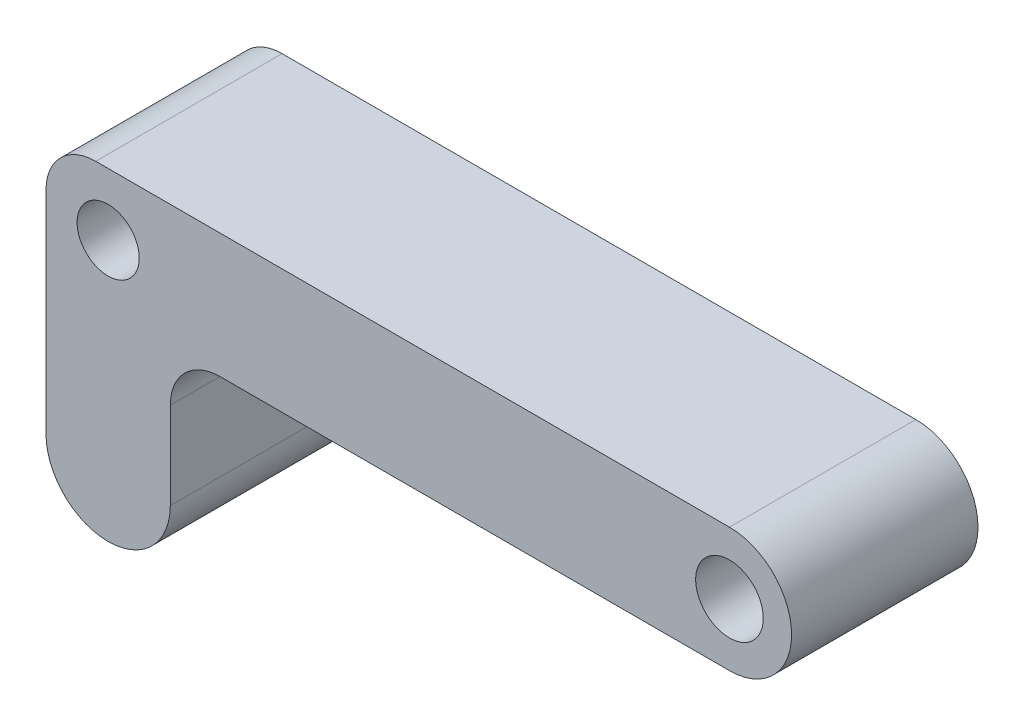
ISO-10303-21;
HEADER;
FILE_DESCRIPTION(('STEP AP214'),'2;1');
FILE_NAME('part.step','',(''),(''),'','','');
FILE_SCHEMA(('AUTOMOTIVE_DESIGN { 1 0 10303 214 1 1 1 1 }'));
ENDSEC;
DATA;
#1=APPLICATION_CONTEXT('core data for automotive mechanical design processes');
#2=APPLICATION_PROTOCOL_DEFINITION('international standard','automotive_design',2000,#1);
#3=PRODUCT_CONTEXT('',#1,'mechanical');
#4=PRODUCT('Part','Part','',(#3));
#5=PRODUCT_RELATED_PRODUCT_CATEGORY('part','',(#4));
#6=PRODUCT_DEFINITION_FORMATION('','',#4);
#7=PRODUCT_DEFINITION_CONTEXT('part definition',#1,'design');
#8=PRODUCT_DEFINITION('design','',#6,#7);
#9=PRODUCT_DEFINITION_SHAPE('','',#8);
#10=(LENGTH_UNIT() NAMED_UNIT(*) SI_UNIT(.MILLI.,.METRE.));
#11=(NAMED_UNIT(*) PLANE_ANGLE_UNIT() SI_UNIT($,.RADIAN.));
#12=(NAMED_UNIT(*) SI_UNIT($,.STERADIAN.) SOLID_ANGLE_UNIT());
#13=UNCERTAINTY_MEASURE_WITH_UNIT(LENGTH_MEASURE(1.E-05),#10,'distance_accuracy_value','');
#14=(GEOMETRIC_REPRESENTATION_CONTEXT(3) GLOBAL_UNCERTAINTY_ASSIGNED_CONTEXT((#13)) GLOBAL_UNIT_ASSIGNED_CONTEXT((#10,
#11,#12)) REPRESENTATION_CONTEXT('',''));
#15=CARTESIAN_POINT('',(0.,0.,0.));
#16=DIRECTION('',(0.,0.,1.));
#17=DIRECTION('',(1.,0.,0.));
#18=AXIS2_PLACEMENT_3D('',#15,#16,#17);
#19=CARTESIAN_POINT('',(3.175,6.98500000000001,9.525));
#20=DIRECTION('',(0.,1.,0.));
#21=DIRECTION('',(-1.,0.,0.));
#22=AXIS2_PLACEMENT_3D('',#19,#20,#21);
#23=PLANE('',#22);
#24=DIRECTION('',(1.,0.,0.));
#25=VECTOR('',#24,1.);
#26=CARTESIAN_POINT('',(3.175,6.98500000000001,9.525));
#27=LINE('',#26,#25);
#28=CARTESIAN_POINT('',(5.71499999999999,6.98500000000002,9.525));
#29=VERTEX_POINT('',#28);
#30=CARTESIAN_POINT('',(31.75,6.98500000000012,9.525));
#31=VERTEX_POINT('',#30);
#32=EDGE_CURVE('E96',#29,#31,#27,.T.);
#33=ORIENTED_EDGE('',*,*,#32,.F.);
#34=DIRECTION('',(0.,0.,-1.));
#35=VECTOR('',#34,1.);
#36=CARTESIAN_POINT('',(5.71499999999999,6.98500000000002,0.));
#37=LINE('',#36,#35);
#38=CARTESIAN_POINT('',(5.71499999999999,6.98500000000002,0.));
#39=VERTEX_POINT('',#38);
#40=EDGE_CURVE('E134',#29,#39,#37,.T.);
#41=ORIENTED_EDGE('',*,*,#40,.T.);
#42=DIRECTION('',(1.,0.,0.));
#43=VECTOR('',#42,1.);
#44=CARTESIAN_POINT('',(3.175,6.98500000000001,0.));
#45=LINE('',#44,#43);
#46=CARTESIAN_POINT('',(31.75,6.98500000000012,0.));
#47=VERTEX_POINT('',#46);
#48=EDGE_CURVE('E118',#39,#47,#45,.T.);
#49=ORIENTED_EDGE('',*,*,#48,.T.);
#50=DIRECTION('',(0.,0.,-1.));
#51=VECTOR('',#50,1.);
#52=CARTESIAN_POINT('',(31.75,6.98500000000012,9.525));
#53=LINE('',#52,#51);
#54=EDGE_CURVE('E111',#31,#47,#53,.T.);
#55=ORIENTED_EDGE('',*,*,#54,.F.);
#56=EDGE_LOOP('',(#33,#41,#49,#55));
#57=FACE_BOUND('',#56,.T.);
#58=ADVANCED_FACE('F34',(#57),#23,.F.);
#59=CARTESIAN_POINT('',(31.75,10.1600000000001,9.525));
#60=DIRECTION('',(0.,0.,-1.));
#61=DIRECTION('',(-1.,0.,0.));
#62=AXIS2_PLACEMENT_3D('',#59,#60,#61);
#63=CYLINDRICAL_SURFACE('',#62,3.175);
#64=CARTESIAN_POINT('',(31.75,10.1600000000001,0.));
#65=DIRECTION('',(0.,0.,1.));
#66=DIRECTION('',(-1.,0.,0.));
#67=AXIS2_PLACEMENT_3D('',#64,#65,#66);
#68=CIRCLE('',#67,3.175);
#69=CARTESIAN_POINT('',(31.75,13.3350000000001,0.));
#70=VERTEX_POINT('',#69);
#71=EDGE_CURVE('E214',#47,#70,#68,.T.);
#72=ORIENTED_EDGE('',*,*,#71,.T.);
#73=DIRECTION('',(0.,0.,-1.));
#74=VECTOR('',#73,1.);
#75=CARTESIAN_POINT('',(31.75,13.3350000000001,9.525));
#76=LINE('',#75,#74);
#77=CARTESIAN_POINT('',(31.75,13.3350000000001,9.525));
#78=VERTEX_POINT('',#77);
#79=EDGE_CURVE('E113',#78,#70,#76,.T.);
#80=ORIENTED_EDGE('',*,*,#79,.F.);
#81=CARTESIAN_POINT('',(31.75,10.1600000000001,9.525));
#82=DIRECTION('',(0.,0.,1.));
#83=DIRECTION('',(-1.,0.,0.));
#84=AXIS2_PLACEMENT_3D('',#81,#82,#83);
#85=CIRCLE('',#84,3.175);
#86=EDGE_CURVE('E100',#31,#78,#85,.T.);
#87=ORIENTED_EDGE('',*,*,#86,.F.);
#88=ORIENTED_EDGE('',*,*,#54,.T.);
#89=EDGE_LOOP('',(#72,#80,#87,#88));
#90=FACE_BOUND('',#89,.T.);
#91=ADVANCED_FACE('F110',(#90),#63,.T.);
#92=CARTESIAN_POINT('',(-3.175,13.335,9.525));
#93=DIRECTION('',(0.,-1.,0.));
#94=DIRECTION('',(1.,0.,0.));
#95=AXIS2_PLACEMENT_3D('',#92,#93,#94);
#96=PLANE('',#95);
#97=DIRECTION('',(-1.,0.,0.));
#98=VECTOR('',#97,1.);
#99=CARTESIAN_POINT('',(-3.175,13.335,0.));
#100=LINE('',#99,#98);
#101=CARTESIAN_POINT('',(-0.635000000000009,13.335,0.));
#102=VERTEX_POINT('',#101);
#103=EDGE_CURVE('E216',#70,#102,#100,.T.);
#104=ORIENTED_EDGE('',*,*,#103,.T.);
#105=DIRECTION('',(0.,0.,-1.));
#106=VECTOR('',#105,1.);
#107=CARTESIAN_POINT('',(-0.635000000000009,13.335,9.525));
#108=LINE('',#107,#106);
#109=CARTESIAN_POINT('',(-0.635000000000009,13.335,9.525));
#110=VERTEX_POINT('',#109);
#111=EDGE_CURVE('E130',#102,#110,#108,.F.);
#112=ORIENTED_EDGE('',*,*,#111,.T.);
#113=DIRECTION('',(-1.,0.,0.));
#114=VECTOR('',#113,1.);
#115=CARTESIAN_POINT('',(-3.175,13.335,9.525));
#116=LINE('',#115,#114);
#117=EDGE_CURVE('E115',#78,#110,#116,.T.);
#118=ORIENTED_EDGE('',*,*,#117,.F.);
#119=ORIENTED_EDGE('',*,*,#79,.T.);
#120=EDGE_LOOP('',(#104,#112,#118,#119));
#121=FACE_BOUND('',#120,.T.);
#122=ADVANCED_FACE('F164',(#121),#96,.F.);
#123=CARTESIAN_POINT('',(-3.175,13.335,9.525));
#124=DIRECTION('',(1.,0.,0.));
#125=DIRECTION('',(0.,1.,0.));
#126=AXIS2_PLACEMENT_3D('',#123,#124,#125);
#127=PLANE('',#126);
#128=DIRECTION('',(0.,-1.,0.));
#129=VECTOR('',#128,1.);
#130=CARTESIAN_POINT('',(-3.175,13.335,9.525));
#131=LINE('',#130,#129);
#132=CARTESIAN_POINT('',(-3.175,10.795,9.525));
#133=VERTEX_POINT('',#132);
#134=CARTESIAN_POINT('',(-3.175,0.,9.525));
#135=VERTEX_POINT('',#134);
#136=EDGE_CURVE('E207',#133,#135,#131,.T.);
#137=ORIENTED_EDGE('',*,*,#136,.F.);
#138=DIRECTION('',(0.,0.,-1.));
#139=VECTOR('',#138,1.);
#140=CARTESIAN_POINT('',(-3.175,10.795,9.525));
#141=LINE('',#140,#139);
#142=CARTESIAN_POINT('',(-3.175,10.795,0.));
#143=VERTEX_POINT('',#142);
#144=EDGE_CURVE('E120',#133,#143,#141,.T.);
#145=ORIENTED_EDGE('',*,*,#144,.T.);
#146=DIRECTION('',(0.,-1.,0.));
#147=VECTOR('',#146,1.);
#148=CARTESIAN_POINT('',(-3.175,13.335,0.));
#149=LINE('',#148,#147);
#150=CARTESIAN_POINT('',(-3.175,0.,0.));
#151=VERTEX_POINT('',#150);
#152=EDGE_CURVE('E219',#143,#151,#149,.T.);
#153=ORIENTED_EDGE('',*,*,#152,.T.);
#154=DIRECTION('',(0.,0.,-1.));
#155=VECTOR('',#154,1.);
#156=CARTESIAN_POINT('',(-3.175,0.,9.525));
#157=LINE('',#156,#155);
#158=EDGE_CURVE('E125',#135,#151,#157,.T.);
#159=ORIENTED_EDGE('',*,*,#158,.F.);
#160=EDGE_LOOP('',(#137,#145,#153,#159));
#161=FACE_BOUND('',#160,.T.);
#162=ADVANCED_FACE('F169',(#161),#127,.F.);
#163=CARTESIAN_POINT('',(0.,0.,9.525));
#164=DIRECTION('',(0.,0.,-1.));
#165=DIRECTION('',(-1.,0.,0.));
#166=AXIS2_PLACEMENT_3D('',#163,#164,#165);
#167=CYLINDRICAL_SURFACE('',#166,3.175);
#168=CARTESIAN_POINT('',(0.,0.,0.));
#169=DIRECTION('',(0.,0.,1.));
#170=DIRECTION('',(-1.,0.,0.));
#171=AXIS2_PLACEMENT_3D('',#168,#169,#170);
#172=CIRCLE('',#171,3.175);
#173=CARTESIAN_POINT('',(3.175,0.,0.));
#174=VERTEX_POINT('',#173);
#175=EDGE_CURVE('E146',#151,#174,#172,.T.);
#176=ORIENTED_EDGE('',*,*,#175,.T.);
#177=DIRECTION('',(0.,0.,-1.));
#178=VECTOR('',#177,1.);
#179=CARTESIAN_POINT('',(3.175,0.,9.525));
#180=LINE('',#179,#178);
#181=CARTESIAN_POINT('',(3.175,0.,9.525));
#182=VERTEX_POINT('',#181);
#183=EDGE_CURVE('E145',#182,#174,#180,.T.);
#184=ORIENTED_EDGE('',*,*,#183,.F.);
#185=CARTESIAN_POINT('',(0.,0.,9.525));
#186=DIRECTION('',(0.,0.,1.));
#187=DIRECTION('',(-1.,0.,0.));
#188=AXIS2_PLACEMENT_3D('',#185,#186,#187);
#189=CIRCLE('',#188,3.175);
#190=EDGE_CURVE('E209',#135,#182,#189,.T.);
#191=ORIENTED_EDGE('',*,*,#190,.F.);
#192=ORIENTED_EDGE('',*,*,#158,.T.);
#193=EDGE_LOOP('',(#176,#184,#191,#192));
#194=FACE_BOUND('',#193,.T.);
#195=ADVANCED_FACE('F173',(#194),#167,.T.);
#196=CARTESIAN_POINT('',(3.175,6.98500000000001,9.525));
#197=DIRECTION('',(-1.,0.,0.));
#198=DIRECTION('',(0.,-1.,0.));
#199=AXIS2_PLACEMENT_3D('',#196,#197,#198);
#200=PLANE('',#199);
#201=DIRECTION('',(0.,1.,0.));
#202=VECTOR('',#201,1.);
#203=CARTESIAN_POINT('',(3.175,6.98500000000001,0.));
#204=LINE('',#203,#202);
#205=CARTESIAN_POINT('',(3.175,4.44500000000002,0.));
#206=VERTEX_POINT('',#205);
#207=EDGE_CURVE('E106',#174,#206,#204,.T.);
#208=ORIENTED_EDGE('',*,*,#207,.T.);
#209=DIRECTION('',(0.,0.,-1.));
#210=VECTOR('',#209,1.);
#211=CARTESIAN_POINT('',(3.175,4.44500000000002,9.525));
#212=LINE('',#211,#210);
#213=CARTESIAN_POINT('',(3.175,4.44500000000002,9.525));
#214=VERTEX_POINT('',#213);
#215=EDGE_CURVE('E49',#206,#214,#212,.F.);
#216=ORIENTED_EDGE('',*,*,#215,.T.);
#217=DIRECTION('',(0.,1.,0.));
#218=VECTOR('',#217,1.);
#219=CARTESIAN_POINT('',(3.175,6.98500000000001,9.525));
#220=LINE('',#219,#218);
#221=EDGE_CURVE('E211',#182,#214,#220,.T.);
#222=ORIENTED_EDGE('',*,*,#221,.F.);
#223=ORIENTED_EDGE('',*,*,#183,.T.);
#224=EDGE_LOOP('',(#208,#216,#222,#223));
#225=FACE_BOUND('',#224,.T.);
#226=ADVANCED_FACE('F143',(#225),#200,.F.);
#227=CARTESIAN_POINT('',(31.75,10.1600000000001,9.525));
#228=DIRECTION('',(0.,0.,-1.));
#229=DIRECTION('',(-1.,0.,0.));
#230=AXIS2_PLACEMENT_3D('',#227,#228,#229);
#231=PLANE('',#230);
#232=CARTESIAN_POINT('',(31.75,10.1600000000001,9.525));
#233=DIRECTION('',(0.,0.,1.));
#234=DIRECTION('',(1.,0.,0.));
#235=AXIS2_PLACEMENT_3D('',#232,#233,#234);
#236=CIRCLE('',#235,1.72719999999998);
#237=CARTESIAN_POINT('',(33.4772,10.1600000000001,9.525));
#238=VERTEX_POINT('',#237);
#239=EDGE_CURVE('E196',#238,#238,#236,.T.);
#240=ORIENTED_EDGE('',*,*,#239,.F.);
#241=EDGE_LOOP('',(#240));
#242=FACE_BOUND('',#241,.T.);
#243=CARTESIAN_POINT('',(0.,10.16,9.525));
#244=DIRECTION('',(0.,0.,1.));
#245=DIRECTION('',(1.,0.,0.));
#246=AXIS2_PLACEMENT_3D('',#243,#244,#245);
#247=CIRCLE('',#246,1.5875);
#248=CARTESIAN_POINT('',(1.5875,10.16,9.525));
#249=VERTEX_POINT('',#248);
#250=EDGE_CURVE('E198',#249,#249,#247,.T.);
#251=ORIENTED_EDGE('',*,*,#250,.F.);
#252=EDGE_LOOP('',(#251));
#253=FACE_BOUND('',#252,.T.);
#254=ORIENTED_EDGE('',*,*,#117,.T.);
#255=CARTESIAN_POINT('',(-0.635,10.795,9.525));
#256=DIRECTION('',(0.,0.,-1.));
#257=DIRECTION('',(-1.,0.,0.));
#258=AXIS2_PLACEMENT_3D('',#255,#256,#257);
#259=CIRCLE('',#258,2.54);
#260=EDGE_CURVE('E132',#110,#133,#259,.F.);
#261=ORIENTED_EDGE('',*,*,#260,.T.);
#262=ORIENTED_EDGE('',*,*,#136,.T.);
#263=ORIENTED_EDGE('',*,*,#190,.T.);
#264=ORIENTED_EDGE('',*,*,#221,.T.);
#265=CARTESIAN_POINT('',(5.715,4.44500000000002,9.525));
#266=DIRECTION('',(0.,0.,-1.));
#267=DIRECTION('',(-1.,0.,0.));
#268=AXIS2_PLACEMENT_3D('',#265,#266,#267);
#269=CIRCLE('',#268,2.54);
#270=EDGE_CURVE('E11',#214,#29,#269,.T.);
#271=ORIENTED_EDGE('',*,*,#270,.T.);
#272=ORIENTED_EDGE('',*,*,#32,.T.);
#273=ORIENTED_EDGE('',*,*,#86,.T.);
#274=EDGE_LOOP('',(#254,#261,#262,#263,#264,#271,#272,#273));
#275=FACE_BOUND('',#274,.T.);
#276=ADVANCED_FACE('F99',(#242,#253,#275),#231,.F.);
#277=CARTESIAN_POINT('',(31.75,10.1600000000001,0.));
#278=DIRECTION('',(0.,0.,-1.));
#279=DIRECTION('',(-1.,0.,0.));
#280=AXIS2_PLACEMENT_3D('',#277,#278,#279);
#281=PLANE('',#280);
#282=CARTESIAN_POINT('',(31.75,10.1600000000001,0.));
#283=DIRECTION('',(0.,0.,1.));
#284=DIRECTION('',(1.,0.,0.));
#285=AXIS2_PLACEMENT_3D('',#282,#283,#284);
#286=CIRCLE('',#285,1.7272);
#287=CARTESIAN_POINT('',(33.4772,10.1600000000001,0.));
#288=VERTEX_POINT('',#287);
#289=EDGE_CURVE('E193',#288,#288,#286,.T.);
#290=ORIENTED_EDGE('',*,*,#289,.T.);
#291=EDGE_LOOP('',(#290));
#292=FACE_BOUND('',#291,.T.);
#293=CARTESIAN_POINT('',(0.,10.16,0.));
#294=DIRECTION('',(0.,0.,1.));
#295=DIRECTION('',(1.,0.,0.));
#296=AXIS2_PLACEMENT_3D('',#293,#294,#295);
#297=CIRCLE('',#296,1.5875);
#298=CARTESIAN_POINT('',(1.5875,10.16,0.));
#299=VERTEX_POINT('',#298);
#300=EDGE_CURVE('E201',#299,#299,#297,.T.);
#301=ORIENTED_EDGE('',*,*,#300,.T.);
#302=EDGE_LOOP('',(#301));
#303=FACE_BOUND('',#302,.T.);
#304=ORIENTED_EDGE('',*,*,#152,.F.);
#305=CARTESIAN_POINT('',(-0.635,10.795,0.));
#306=DIRECTION('',(0.,0.,-1.));
#307=DIRECTION('',(-1.,0.,0.));
#308=AXIS2_PLACEMENT_3D('',#305,#306,#307);
#309=CIRCLE('',#308,2.54);
#310=EDGE_CURVE('E123',#143,#102,#309,.T.);
#311=ORIENTED_EDGE('',*,*,#310,.T.);
#312=ORIENTED_EDGE('',*,*,#103,.F.);
#313=ORIENTED_EDGE('',*,*,#71,.F.);
#314=ORIENTED_EDGE('',*,*,#48,.F.);
#315=CARTESIAN_POINT('',(5.715,4.44500000000002,0.));
#316=DIRECTION('',(0.,0.,-1.));
#317=DIRECTION('',(-1.,0.,0.));
#318=AXIS2_PLACEMENT_3D('',#315,#316,#317);
#319=CIRCLE('',#318,2.54);
#320=EDGE_CURVE('E42',#39,#206,#319,.F.);
#321=ORIENTED_EDGE('',*,*,#320,.T.);
#322=ORIENTED_EDGE('',*,*,#207,.F.);
#323=ORIENTED_EDGE('',*,*,#175,.F.);
#324=EDGE_LOOP('',(#304,#311,#312,#313,#314,#321,#322,#323));
#325=FACE_BOUND('',#324,.T.);
#326=ADVANCED_FACE('F139',(#292,#303,#325),#281,.T.);
#327=CARTESIAN_POINT('',(-0.635,10.795,9.525));
#328=DIRECTION('',(0.,0.,-1.));
#329=DIRECTION('',(-1.,0.,0.));
#330=AXIS2_PLACEMENT_3D('',#327,#328,#329);
#331=CYLINDRICAL_SURFACE('',#330,2.54);
#332=ORIENTED_EDGE('',*,*,#260,.F.);
#333=ORIENTED_EDGE('',*,*,#111,.F.);
#334=ORIENTED_EDGE('',*,*,#310,.F.);
#335=ORIENTED_EDGE('',*,*,#144,.F.);
#336=EDGE_LOOP('',(#332,#333,#334,#335));
#337=FACE_BOUND('',#336,.T.);
#338=ADVANCED_FACE('F150',(#337),#331,.T.);
#339=CARTESIAN_POINT('',(5.715,4.44500000000002,9.525));
#340=DIRECTION('',(0.,0.,1.));
#341=DIRECTION('',(1.,0.,0.));
#342=AXIS2_PLACEMENT_3D('',#339,#340,#341);
#343=CYLINDRICAL_SURFACE('',#342,2.54);
#344=ORIENTED_EDGE('',*,*,#270,.F.);
#345=ORIENTED_EDGE('',*,*,#215,.F.);
#346=ORIENTED_EDGE('',*,*,#320,.F.);
#347=ORIENTED_EDGE('',*,*,#40,.F.);
#348=EDGE_LOOP('',(#344,#345,#346,#347));
#349=FACE_BOUND('',#348,.T.);
#350=ADVANCED_FACE('F36',(#349),#343,.F.);
#351=CARTESIAN_POINT('',(0.,10.16,0.));
#352=DIRECTION('',(0.,0.,1.));
#353=DIRECTION('',(1.,0.,0.));
#354=AXIS2_PLACEMENT_3D('',#351,#352,#353);
#355=CYLINDRICAL_SURFACE('',#354,1.5875);
#356=CARTESIAN_POINT('',(1.5875,10.16,0.));
#357=CARTESIAN_POINT('',(1.5875,10.16,0.0992187499999999));
#358=CARTESIAN_POINT('',(1.5875,10.16,0.1984375));
#359=CARTESIAN_POINT('',(1.5875,10.16,0.396875));
#360=CARTESIAN_POINT('',(1.5875,10.16,0.49609375));
#361=CARTESIAN_POINT('',(1.5875,10.16,0.69453125));
#362=CARTESIAN_POINT('',(1.5875,10.16,0.79375));
#363=CARTESIAN_POINT('',(1.5875,10.16,0.9921875));
#364=CARTESIAN_POINT('',(1.5875,10.16,1.09140625));
#365=CARTESIAN_POINT('',(1.5875,10.16,1.28984375));
#366=CARTESIAN_POINT('',(1.5875,10.16,1.3890625));
#367=CARTESIAN_POINT('',(1.5875,10.16,1.5875));
#368=CARTESIAN_POINT('',(1.5875,10.16,1.68671875));
#369=CARTESIAN_POINT('',(1.5875,10.16,1.88515625));
#370=CARTESIAN_POINT('',(1.5875,10.16,1.984375));
#371=CARTESIAN_POINT('',(1.5875,10.16,2.1828125));
#372=CARTESIAN_POINT('',(1.5875,10.16,2.28203125));
#373=CARTESIAN_POINT('',(1.5875,10.16,2.48046875));
#374=CARTESIAN_POINT('',(1.5875,10.16,2.5796875));
#375=CARTESIAN_POINT('',(1.5875,10.16,2.778125));
#376=CARTESIAN_POINT('',(1.5875,10.16,2.87734375));
#377=CARTESIAN_POINT('',(1.5875,10.16,3.07578125));
#378=CARTESIAN_POINT('',(1.5875,10.16,3.175));
#379=CARTESIAN_POINT('',(1.5875,10.16,3.3734375));
#380=CARTESIAN_POINT('',(1.5875,10.16,3.47265625));
#381=CARTESIAN_POINT('',(1.5875,10.16,3.67109375));
#382=CARTESIAN_POINT('',(1.5875,10.16,3.7703125));
#383=CARTESIAN_POINT('',(1.5875,10.16,3.96875));
#384=CARTESIAN_POINT('',(1.5875,10.16,4.06796875));
#385=CARTESIAN_POINT('',(1.5875,10.16,4.26640625));
#386=CARTESIAN_POINT('',(1.5875,10.16,4.365625));
#387=CARTESIAN_POINT('',(1.5875,10.16,4.5640625));
#388=CARTESIAN_POINT('',(1.5875,10.16,4.66328125));
#389=CARTESIAN_POINT('',(1.5875,10.16,4.86171875));
#390=CARTESIAN_POINT('',(1.5875,10.16,4.9609375));
#391=CARTESIAN_POINT('',(1.5875,10.16,5.159375));
#392=CARTESIAN_POINT('',(1.5875,10.16,5.25859375));
#393=CARTESIAN_POINT('',(1.5875,10.16,5.45703125));
#394=CARTESIAN_POINT('',(1.5875,10.16,5.55625));
#395=CARTESIAN_POINT('',(1.5875,10.16,5.7546875));
#396=CARTESIAN_POINT('',(1.5875,10.16,5.85390625));
#397=CARTESIAN_POINT('',(1.5875,10.16,6.05234375));
#398=CARTESIAN_POINT('',(1.5875,10.16,6.1515625));
#399=CARTESIAN_POINT('',(1.5875,10.16,6.35));
#400=CARTESIAN_POINT('',(1.5875,10.16,6.44921875));
#401=CARTESIAN_POINT('',(1.5875,10.16,6.64765625));
#402=CARTESIAN_POINT('',(1.5875,10.16,6.746875));
#403=CARTESIAN_POINT('',(1.5875,10.16,6.9453125));
#404=CARTESIAN_POINT('',(1.5875,10.16,7.04453125));
#405=CARTESIAN_POINT('',(1.5875,10.16,7.24296875));
#406=CARTESIAN_POINT('',(1.5875,10.16,7.3421875));
#407=CARTESIAN_POINT('',(1.5875,10.16,7.540625));
#408=CARTESIAN_POINT('',(1.5875,10.16,7.63984375));
#409=CARTESIAN_POINT('',(1.5875,10.16,7.83828125));
#410=CARTESIAN_POINT('',(1.5875,10.16,7.9375));
#411=CARTESIAN_POINT('',(1.5875,10.16,8.1359375));
#412=CARTESIAN_POINT('',(1.5875,10.16,8.23515625));
#413=CARTESIAN_POINT('',(1.5875,10.16,8.43359375));
#414=CARTESIAN_POINT('',(1.5875,10.16,8.5328125));
#415=CARTESIAN_POINT('',(1.5875,10.16,8.73125));
#416=CARTESIAN_POINT('',(1.5875,10.16,8.83046875));
#417=CARTESIAN_POINT('',(1.5875,10.16,9.02890625));
#418=CARTESIAN_POINT('',(1.5875,10.16,9.128125));
#419=CARTESIAN_POINT('',(1.5875,10.16,9.3265625));
#420=CARTESIAN_POINT('',(1.5875,10.16,9.42578125));
#421=CARTESIAN_POINT('',(1.5875,10.16,9.525));
#422=B_SPLINE_CURVE_WITH_KNOTS('',3,(#356,#357,#358,#359,#360,#361,#362,#363,#364,#365,#366,
#367,#368,#369,#370,#371,#372,#373,#374,#375,#376,#377,#378,#379,#380,#381,#382,#383,#384,#385,
#386,#387,#388,#389,#390,#391,#392,#393,#394,#395,#396,#397,#398,#399,#400,#401,#402,#403,#404,
#405,#406,#407,#408,#409,#410,#411,#412,#413,#414,#415,#416,#417,#418,#419,#420,#421),
.UNSPECIFIED.,.F.,.F.,(4,2,2,2,2,2,2,2,2,2,2,2,2,2,2,2,2,2,2,2,2,2,2,2,2,2,2,2,2,2,2,2,4),(0.,
0.29765625,0.5953125,0.89296875,1.190625,1.48828125,1.7859375,2.08359375,2.38125,2.67890625,
2.9765625,3.27421875,3.571875,3.86953125,4.1671875,4.46484375,4.7625,5.06015625,5.3578125,
5.65546875,5.953125,6.25078125,6.5484375,6.84609375,7.14375,7.44140625,7.7390625,8.03671875,
8.334375,8.63203125,8.9296875,9.22734375,9.525),.UNSPECIFIED.);
#423=EDGE_CURVE('BSEAM149',#299,#249,#422,.T.);
#424=ORIENTED_EDGE('',*,*,#300,.F.);
#425=ORIENTED_EDGE('',*,*,#250,.T.);
#426=ORIENTED_EDGE('',*,*,#423,.T.);
#427=ORIENTED_EDGE('',*,*,#423,.F.);
#428=EDGE_LOOP('',(#424,#426,#425,#427));
#429=FACE_BOUND('',#428,.T.);
#430=ADVANCED_FACE('F149',(#429),#355,.F.);
#431=CARTESIAN_POINT('',(31.75,10.1600000000001,9.525));
#432=DIRECTION('',(0.,0.,1.));
#433=DIRECTION('',(1.,0.,0.));
#434=AXIS2_PLACEMENT_3D('',#431,#432,#433);
#435=CYLINDRICAL_SURFACE('',#434,1.72719999999999);
#436=ORIENTED_EDGE('',*,*,#289,.F.);
#437=EDGE_LOOP('',(#436));
#438=FACE_BOUND('',#437,.T.);
#439=ORIENTED_EDGE('',*,*,#239,.T.);
#440=EDGE_LOOP('',(#439));
#441=FACE_BOUND('',#440,.T.);
#442=ADVANCED_FACE('F155',(#438,#441),#435,.F.);
#443=CLOSED_SHELL('',(#58,#91,#122,#162,#195,#226,#276,#326,#338,#350,#430,#442));
#444=MANIFOLD_SOLID_BREP('B2',#443);
#445=ADVANCED_BREP_SHAPE_REPRESENTATION('',(#18,#444),#14);
#446=SHAPE_DEFINITION_REPRESENTATION(#9,#445);
ENDSEC;
END-ISO-10303-21;
